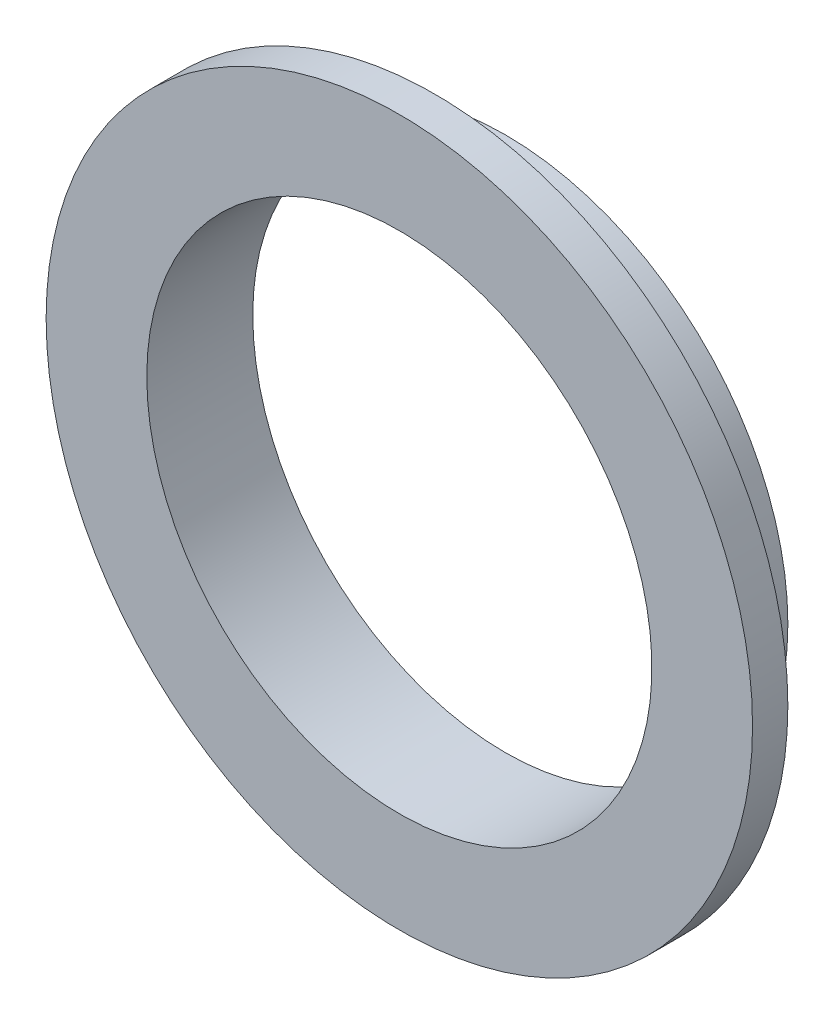
ISO-10303-21;
HEADER;
FILE_DESCRIPTION(('STEP AP214'),'2;1');
FILE_NAME('part.step','',(''),(''),'','','');
FILE_SCHEMA(('AUTOMOTIVE_DESIGN { 1 0 10303 214 1 1 1 1 }'));
ENDSEC;
DATA;
#1=APPLICATION_CONTEXT('core data for automotive mechanical design processes');
#2=APPLICATION_PROTOCOL_DEFINITION('international standard','automotive_design',2000,#1);
#3=PRODUCT_CONTEXT('',#1,'mechanical');
#4=PRODUCT('Part','Part','',(#3));
#5=PRODUCT_RELATED_PRODUCT_CATEGORY('part','',(#4));
#6=PRODUCT_DEFINITION_FORMATION('','',#4);
#7=PRODUCT_DEFINITION_CONTEXT('part definition',#1,'design');
#8=PRODUCT_DEFINITION('design','',#6,#7);
#9=PRODUCT_DEFINITION_SHAPE('','',#8);
#10=(LENGTH_UNIT() NAMED_UNIT(*) SI_UNIT(.MILLI.,.METRE.));
#11=(NAMED_UNIT(*) PLANE_ANGLE_UNIT() SI_UNIT($,.RADIAN.));
#12=(NAMED_UNIT(*) SI_UNIT($,.STERADIAN.) SOLID_ANGLE_UNIT());
#13=UNCERTAINTY_MEASURE_WITH_UNIT(LENGTH_MEASURE(1.E-05),#10,'distance_accuracy_value','');
#14=(GEOMETRIC_REPRESENTATION_CONTEXT(3) GLOBAL_UNCERTAINTY_ASSIGNED_CONTEXT((#13)) GLOBAL_UNIT_ASSIGNED_CONTEXT((#10,
#11,#12)) REPRESENTATION_CONTEXT('',''));
#15=CARTESIAN_POINT('',(0.,0.,0.));
#16=DIRECTION('',(0.,0.,1.));
#17=DIRECTION('',(1.,0.,0.));
#18=AXIS2_PLACEMENT_3D('',#15,#16,#17);
#19=CARTESIAN_POINT('',(0.,0.,0.));
#20=DIRECTION('',(0.,0.,1.));
#21=DIRECTION('',(1.,0.,0.));
#22=AXIS2_PLACEMENT_3D('',#19,#20,#21);
#23=PLANE('',#22);
#24=CARTESIAN_POINT('',(0.,0.,0.));
#25=DIRECTION('',(0.,0.,1.));
#26=DIRECTION('',(1.,0.,0.));
#27=AXIS2_PLACEMENT_3D('',#24,#25,#26);
#28=CIRCLE('',#27,16.);
#29=CARTESIAN_POINT('',(16.,0.,0.));
#30=VERTEX_POINT('',#29);
#31=EDGE_CURVE('E41',#30,#30,#28,.T.);
#32=ORIENTED_EDGE('',*,*,#31,.F.);
#33=EDGE_LOOP('',(#32));
#34=FACE_BOUND('',#33,.T.);
#35=CARTESIAN_POINT('',(0.,0.,0.));
#36=DIRECTION('',(0.,0.,1.));
#37=DIRECTION('',(1.,0.,0.));
#38=AXIS2_PLACEMENT_3D('',#35,#36,#37);
#39=CIRCLE('',#38,14.3);
#40=CARTESIAN_POINT('',(14.3,0.,0.));
#41=VERTEX_POINT('',#40);
#42=EDGE_CURVE('E50',#41,#41,#39,.T.);
#43=ORIENTED_EDGE('',*,*,#42,.T.);
#44=EDGE_LOOP('',(#43));
#45=FACE_BOUND('',#44,.T.);
#46=ADVANCED_FACE('F37',(#34,#45),#23,.F.);
#47=CARTESIAN_POINT('',(0.,0.,4.));
#48=DIRECTION('',(0.,0.,-1.));
#49=DIRECTION('',(-1.,0.,0.));
#50=AXIS2_PLACEMENT_3D('',#47,#48,#49);
#51=CYLINDRICAL_SURFACE('',#50,16.);
#52=CARTESIAN_POINT('',(0.,0.,4.));
#53=DIRECTION('',(0.,0.,1.));
#54=DIRECTION('',(1.,0.,0.));
#55=AXIS2_PLACEMENT_3D('',#52,#53,#54);
#56=CIRCLE('',#55,16.);
#57=CARTESIAN_POINT('',(16.,0.,4.));
#58=VERTEX_POINT('',#57);
#59=EDGE_CURVE('E10',#58,#58,#56,.T.);
#60=ORIENTED_EDGE('',*,*,#59,.F.);
#61=EDGE_LOOP('',(#60));
#62=FACE_BOUND('',#61,.T.);
#63=ORIENTED_EDGE('',*,*,#31,.T.);
#64=EDGE_LOOP('',(#63));
#65=FACE_BOUND('',#64,.T.);
#66=ADVANCED_FACE('F39',(#62,#65),#51,.T.);
#67=CARTESIAN_POINT('',(0.,0.,4.));
#68=DIRECTION('',(0.,0.,-1.));
#69=DIRECTION('',(-1.,0.,0.));
#70=AXIS2_PLACEMENT_3D('',#67,#68,#69);
#71=CYLINDRICAL_SURFACE('',#70,14.3);
#72=ORIENTED_EDGE('',*,*,#42,.F.);
#73=EDGE_LOOP('',(#72));
#74=FACE_BOUND('',#73,.T.);
#75=CARTESIAN_POINT('',(0.,0.,6.));
#76=DIRECTION('',(0.,0.,-1.));
#77=DIRECTION('',(-1.,0.,0.));
#78=AXIS2_PLACEMENT_3D('',#75,#76,#77);
#79=CIRCLE('',#78,14.3);
#80=CARTESIAN_POINT('',(-14.3,0.,6.));
#81=VERTEX_POINT('',#80);
#82=EDGE_CURVE('E60',#81,#81,#79,.T.);
#83=ORIENTED_EDGE('',*,*,#82,.F.);
#84=EDGE_LOOP('',(#83));
#85=FACE_BOUND('',#84,.T.);
#86=ADVANCED_FACE('F71',(#74,#85),#71,.F.);
#87=CARTESIAN_POINT('',(0.,0.,6.));
#88=DIRECTION('',(0.,0.,-1.));
#89=DIRECTION('',(-1.,0.,0.));
#90=AXIS2_PLACEMENT_3D('',#87,#88,#89);
#91=CYLINDRICAL_SURFACE('',#90,20.);
#92=CARTESIAN_POINT('',(0.,0.,6.));
#93=DIRECTION('',(0.,0.,1.));
#94=DIRECTION('',(1.,0.,0.));
#95=AXIS2_PLACEMENT_3D('',#92,#93,#94);
#96=CIRCLE('',#95,20.);
#97=CARTESIAN_POINT('',(20.,0.,6.));
#98=VERTEX_POINT('',#97);
#99=EDGE_CURVE('E55',#98,#98,#96,.T.);
#100=ORIENTED_EDGE('',*,*,#99,.F.);
#101=EDGE_LOOP('',(#100));
#102=FACE_BOUND('',#101,.T.);
#103=CARTESIAN_POINT('',(0.,0.,4.));
#104=DIRECTION('',(0.,0.,1.));
#105=DIRECTION('',(1.,0.,0.));
#106=AXIS2_PLACEMENT_3D('',#103,#104,#105);
#107=CIRCLE('',#106,20.);
#108=CARTESIAN_POINT('',(20.,0.,4.));
#109=VERTEX_POINT('',#108);
#110=EDGE_CURVE('E56',#109,#109,#107,.T.);
#111=ORIENTED_EDGE('',*,*,#110,.T.);
#112=EDGE_LOOP('',(#111));
#113=FACE_BOUND('',#112,.T.);
#114=ADVANCED_FACE('F73',(#102,#113),#91,.T.);
#115=CARTESIAN_POINT('',(0.,0.,6.));
#116=DIRECTION('',(0.,0.,1.));
#117=DIRECTION('',(1.,0.,0.));
#118=AXIS2_PLACEMENT_3D('',#115,#116,#117);
#119=PLANE('',#118);
#120=ORIENTED_EDGE('',*,*,#82,.T.);
#121=EDGE_LOOP('',(#120));
#122=FACE_BOUND('',#121,.T.);
#123=ORIENTED_EDGE('',*,*,#99,.T.);
#124=EDGE_LOOP('',(#123));
#125=FACE_BOUND('',#124,.T.);
#126=ADVANCED_FACE('F68',(#122,#125),#119,.T.);
#127=CARTESIAN_POINT('',(0.,0.,4.));
#128=DIRECTION('',(0.,0.,1.));
#129=DIRECTION('',(1.,0.,0.));
#130=AXIS2_PLACEMENT_3D('',#127,#128,#129);
#131=PLANE('',#130);
#132=ORIENTED_EDGE('',*,*,#59,.T.);
#133=EDGE_LOOP('',(#132));
#134=FACE_BOUND('',#133,.T.);
#135=ORIENTED_EDGE('',*,*,#110,.F.);
#136=EDGE_LOOP('',(#135));
#137=FACE_BOUND('',#136,.T.);
#138=ADVANCED_FACE('F109',(#134,#137),#131,.F.);
#139=CLOSED_SHELL('',(#46,#66,#86,#114,#126,#138));
#140=MANIFOLD_SOLID_BREP('B2',#139);
#141=ADVANCED_BREP_SHAPE_REPRESENTATION('',(#18,#140),#14);
#142=SHAPE_DEFINITION_REPRESENTATION(#9,#141);
ENDSEC;
END-ISO-10303-21;
